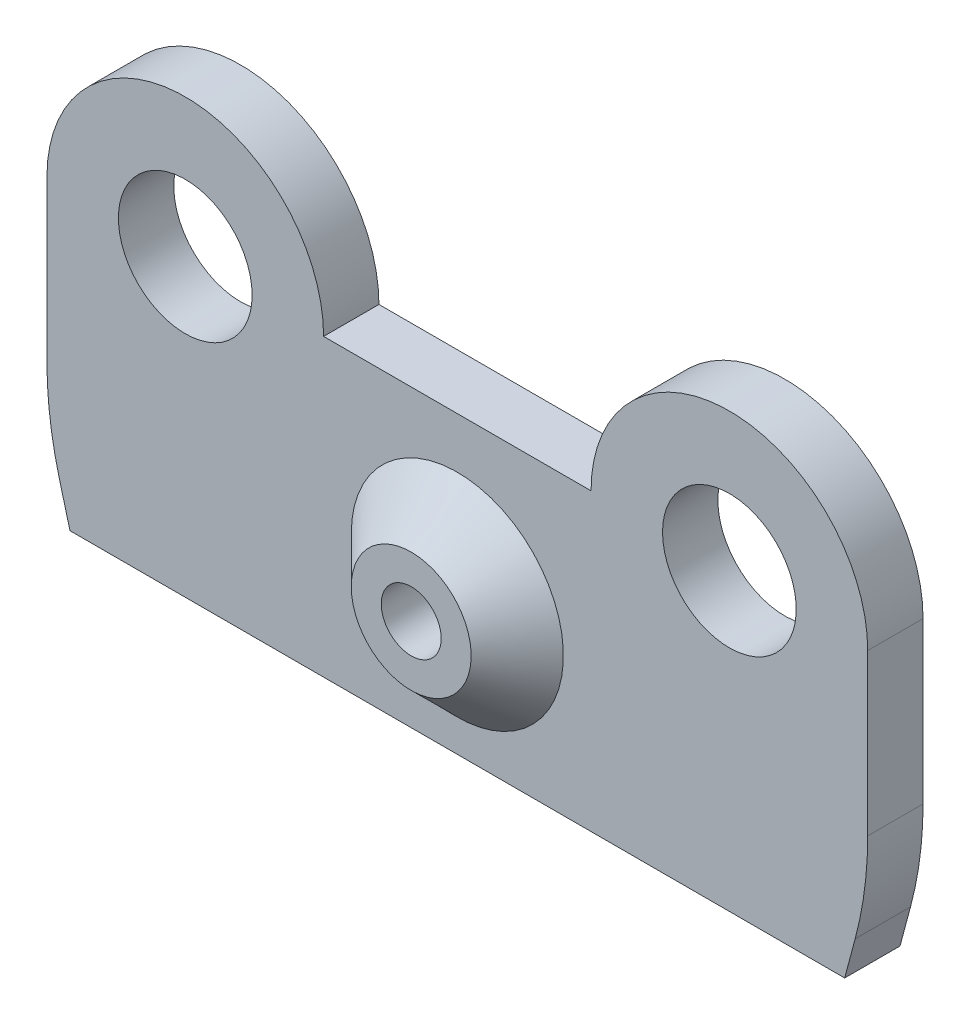
ISO-10303-21;
HEADER;
FILE_DESCRIPTION(('STEP AP214'),'2;1');
FILE_NAME('part.step','',(''),(''),'','','');
FILE_SCHEMA(('AUTOMOTIVE_DESIGN { 1 0 10303 214 1 1 1 1 }'));
ENDSEC;
DATA;
#1=APPLICATION_CONTEXT('core data for automotive mechanical design processes');
#2=APPLICATION_PROTOCOL_DEFINITION('international standard','automotive_design',2000,#1);
#3=PRODUCT_CONTEXT('',#1,'mechanical');
#4=PRODUCT('Part','Part','',(#3));
#5=PRODUCT_RELATED_PRODUCT_CATEGORY('part','',(#4));
#6=PRODUCT_DEFINITION_FORMATION('','',#4);
#7=PRODUCT_DEFINITION_CONTEXT('part definition',#1,'design');
#8=PRODUCT_DEFINITION('design','',#6,#7);
#9=PRODUCT_DEFINITION_SHAPE('','',#8);
#10=(LENGTH_UNIT() NAMED_UNIT(*) SI_UNIT(.MILLI.,.METRE.));
#11=(NAMED_UNIT(*) PLANE_ANGLE_UNIT() SI_UNIT($,.RADIAN.));
#12=(NAMED_UNIT(*) SI_UNIT($,.STERADIAN.) SOLID_ANGLE_UNIT());
#13=UNCERTAINTY_MEASURE_WITH_UNIT(LENGTH_MEASURE(1.E-05),#10,'distance_accuracy_value','');
#14=(GEOMETRIC_REPRESENTATION_CONTEXT(3) GLOBAL_UNCERTAINTY_ASSIGNED_CONTEXT((#13)) GLOBAL_UNIT_ASSIGNED_CONTEXT((#10,
#11,#12)) REPRESENTATION_CONTEXT('',''));
#15=CARTESIAN_POINT('',(0.,0.,0.));
#16=DIRECTION('',(0.,0.,1.));
#17=DIRECTION('',(1.,0.,0.));
#18=AXIS2_PLACEMENT_3D('',#15,#16,#17);
#19=CARTESIAN_POINT('',(29.5,0.,6.));
#20=DIRECTION('',(0.,0.,-1.));
#21=DIRECTION('',(-1.,0.,0.));
#22=AXIS2_PLACEMENT_3D('',#19,#20,#21);
#23=PLANE('',#22);
#24=CARTESIAN_POINT('',(0.,-17.,6.));
#25=DIRECTION('',(0.,0.,-1.));
#26=DIRECTION('',(-1.,0.,0.));
#27=AXIS2_PLACEMENT_3D('',#24,#25,#26);
#28=CIRCLE('',#27,11.5);
#29=CARTESIAN_POINT('',(-11.5,-17.,6.));
#30=VERTEX_POINT('',#29);
#31=EDGE_CURVE('E131',#30,#30,#28,.T.);
#32=ORIENTED_EDGE('',*,*,#31,.T.);
#33=EDGE_LOOP('',(#32));
#34=FACE_BOUND('',#33,.T.);
#35=CARTESIAN_POINT('',(29.5,0.,6.));
#36=DIRECTION('',(0.,0.,1.));
#37=DIRECTION('',(-1.,0.,0.));
#38=AXIS2_PLACEMENT_3D('',#35,#36,#37);
#39=CIRCLE('',#38,7.25);
#40=CARTESIAN_POINT('',(22.25,0.,6.));
#41=VERTEX_POINT('',#40);
#42=EDGE_CURVE('E384',#41,#41,#39,.T.);
#43=ORIENTED_EDGE('',*,*,#42,.F.);
#44=EDGE_LOOP('',(#43));
#45=FACE_BOUND('',#44,.T.);
#46=CARTESIAN_POINT('',(-29.5,0.,6.));
#47=DIRECTION('',(0.,0.,1.));
#48=DIRECTION('',(1.,0.,0.));
#49=AXIS2_PLACEMENT_3D('',#46,#47,#48);
#50=CIRCLE('',#49,7.25);
#51=CARTESIAN_POINT('',(-22.25,0.,6.));
#52=VERTEX_POINT('',#51);
#53=EDGE_CURVE('E169',#52,#52,#50,.T.);
#54=ORIENTED_EDGE('',*,*,#53,.F.);
#55=EDGE_LOOP('',(#54));
#56=FACE_BOUND('',#55,.T.);
#57=DIRECTION('',(-0.258819045102521,-0.965925826289068,0.));
#58=VECTOR('',#57,1.);
#59=CARTESIAN_POINT('',(44.5,-22.6698729810778,6.));
#60=LINE('',#59,#58);
#61=CARTESIAN_POINT('',(42.,-32.,6.));
#62=VERTEX_POINT('',#61);
#63=CARTESIAN_POINT('',(43.1370330515627,-27.7565348816827,6.));
#64=VERTEX_POINT('',#63);
#65=EDGE_CURVE('E160',#62,#64,#60,.F.);
#66=ORIENTED_EDGE('',*,*,#65,.T.);
#67=CARTESIAN_POINT('',(4.49999999999999,-17.4037730775819,6.));
#68=DIRECTION('',(0.,0.,-1.));
#69=DIRECTION('',(-1.,0.,0.));
#70=AXIS2_PLACEMENT_3D('',#67,#68,#69);
#71=CIRCLE('',#70,40.);
#72=CARTESIAN_POINT('',(44.5,-17.4037730775819,6.));
#73=VERTEX_POINT('',#72);
#74=EDGE_CURVE('E11',#64,#73,#71,.F.);
#75=ORIENTED_EDGE('',*,*,#74,.T.);
#76=DIRECTION('',(0.,1.,0.));
#77=VECTOR('',#76,1.);
#78=CARTESIAN_POINT('',(44.5,-32.,6.));
#79=LINE('',#78,#77);
#80=CARTESIAN_POINT('',(44.5,0.,6.));
#81=VERTEX_POINT('',#80);
#82=EDGE_CURVE('E108',#73,#81,#79,.T.);
#83=ORIENTED_EDGE('',*,*,#82,.T.);
#84=CARTESIAN_POINT('',(29.5,0.,6.));
#85=DIRECTION('',(0.,0.,1.));
#86=DIRECTION('',(-1.,0.,0.));
#87=AXIS2_PLACEMENT_3D('',#84,#85,#86);
#88=CIRCLE('',#87,15.);
#89=CARTESIAN_POINT('',(14.5,0.,6.));
#90=VERTEX_POINT('',#89);
#91=EDGE_CURVE('E110',#81,#90,#88,.T.);
#92=ORIENTED_EDGE('',*,*,#91,.T.);
#93=DIRECTION('',(-1.,0.,0.));
#94=VECTOR('',#93,1.);
#95=CARTESIAN_POINT('',(-14.5,0.,6.));
#96=LINE('',#95,#94);
#97=CARTESIAN_POINT('',(-14.5,0.,6.));
#98=VERTEX_POINT('',#97);
#99=EDGE_CURVE('E126',#90,#98,#96,.T.);
#100=ORIENTED_EDGE('',*,*,#99,.T.);
#101=CARTESIAN_POINT('',(-29.5,0.,6.));
#102=DIRECTION('',(0.,0.,1.));
#103=DIRECTION('',(1.,0.,0.));
#104=AXIS2_PLACEMENT_3D('',#101,#102,#103);
#105=CIRCLE('',#104,15.);
#106=CARTESIAN_POINT('',(-44.5,0.,6.));
#107=VERTEX_POINT('',#106);
#108=EDGE_CURVE('E197',#98,#107,#105,.T.);
#109=ORIENTED_EDGE('',*,*,#108,.T.);
#110=DIRECTION('',(0.,-1.,0.));
#111=VECTOR('',#110,1.);
#112=CARTESIAN_POINT('',(-44.5,0.,6.));
#113=LINE('',#112,#111);
#114=CARTESIAN_POINT('',(-44.5,-17.4037730775819,6.));
#115=VERTEX_POINT('',#114);
#116=EDGE_CURVE('E212',#107,#115,#113,.T.);
#117=ORIENTED_EDGE('',*,*,#116,.T.);
#118=CARTESIAN_POINT('',(-4.49999999999999,-17.4037730775819,6.));
#119=DIRECTION('',(0.,0.,-1.));
#120=DIRECTION('',(-1.,0.,0.));
#121=AXIS2_PLACEMENT_3D('',#118,#119,#120);
#122=CIRCLE('',#121,40.);
#123=CARTESIAN_POINT('',(-43.1370330515627,-27.7565348816828,6.));
#124=VERTEX_POINT('',#123);
#125=EDGE_CURVE('E150',#115,#124,#122,.F.);
#126=ORIENTED_EDGE('',*,*,#125,.T.);
#127=DIRECTION('',(-0.258819045102521,0.965925826289068,0.));
#128=VECTOR('',#127,1.);
#129=CARTESIAN_POINT('',(-42.,-32.,6.));
#130=LINE('',#129,#128);
#131=CARTESIAN_POINT('',(-42.,-32.,6.));
#132=VERTEX_POINT('',#131);
#133=EDGE_CURVE('E145',#124,#132,#130,.F.);
#134=ORIENTED_EDGE('',*,*,#133,.T.);
#135=DIRECTION('',(1.,0.,0.));
#136=VECTOR('',#135,1.);
#137=CARTESIAN_POINT('',(-44.5,-32.,6.));
#138=LINE('',#137,#136);
#139=EDGE_CURVE('E177',#132,#62,#138,.T.);
#140=ORIENTED_EDGE('',*,*,#139,.T.);
#141=EDGE_LOOP('',(#66,#75,#83,#92,#100,#109,#117,#126,#134,#140));
#142=FACE_BOUND('',#141,.T.);
#143=ADVANCED_FACE('F33',(#34,#45,#56,#142),#23,.F.);
#144=CARTESIAN_POINT('',(29.5,0.,0.));
#145=DIRECTION('',(0.,0.,-1.));
#146=DIRECTION('',(-1.,0.,0.));
#147=AXIS2_PLACEMENT_3D('',#144,#145,#146);
#148=PLANE('',#147);
#149=CARTESIAN_POINT('',(0.,-17.,0.));
#150=DIRECTION('',(0.,0.,1.));
#151=DIRECTION('',(1.,0.,0.));
#152=AXIS2_PLACEMENT_3D('',#149,#150,#151);
#153=CIRCLE('',#152,3.25);
#154=CARTESIAN_POINT('',(3.25,-17.,0.));
#155=VERTEX_POINT('',#154);
#156=EDGE_CURVE('E387',#155,#155,#153,.T.);
#157=ORIENTED_EDGE('',*,*,#156,.T.);
#158=EDGE_LOOP('',(#157));
#159=FACE_BOUND('',#158,.T.);
#160=DIRECTION('',(0.,1.,0.));
#161=VECTOR('',#160,1.);
#162=CARTESIAN_POINT('',(44.5,-32.,0.));
#163=LINE('',#162,#161);
#164=CARTESIAN_POINT('',(44.5,-17.4037730775819,0.));
#165=VERTEX_POINT('',#164);
#166=CARTESIAN_POINT('',(44.5,0.,0.));
#167=VERTEX_POINT('',#166);
#168=EDGE_CURVE('E129',#165,#167,#163,.T.);
#169=ORIENTED_EDGE('',*,*,#168,.F.);
#170=CARTESIAN_POINT('',(4.49999999999999,-17.4037730775819,0.));
#171=DIRECTION('',(0.,0.,-1.));
#172=DIRECTION('',(-1.,0.,0.));
#173=AXIS2_PLACEMENT_3D('',#170,#171,#172);
#174=CIRCLE('',#173,40.);
#175=CARTESIAN_POINT('',(43.1370330515627,-27.7565348816828,0.));
#176=VERTEX_POINT('',#175);
#177=EDGE_CURVE('E55',#165,#176,#174,.T.);
#178=ORIENTED_EDGE('',*,*,#177,.T.);
#179=DIRECTION('',(0.258819045102521,0.965925826289068,0.));
#180=VECTOR('',#179,1.);
#181=CARTESIAN_POINT('',(49.1626587736527,-5.26859353944898,0.));
#182=LINE('',#181,#180);
#183=CARTESIAN_POINT('',(42.,-32.,0.));
#184=VERTEX_POINT('',#183);
#185=EDGE_CURVE('E156',#176,#184,#182,.F.);
#186=ORIENTED_EDGE('',*,*,#185,.T.);
#187=DIRECTION('',(1.,0.,0.));
#188=VECTOR('',#187,1.);
#189=CARTESIAN_POINT('',(-44.5,-32.,0.));
#190=LINE('',#189,#188);
#191=CARTESIAN_POINT('',(-42.,-32.,0.));
#192=VERTEX_POINT('',#191);
#193=EDGE_CURVE('E117',#192,#184,#190,.T.);
#194=ORIENTED_EDGE('',*,*,#193,.F.);
#195=DIRECTION('',(0.258819045102521,-0.965925826289068,0.));
#196=VECTOR('',#195,1.);
#197=CARTESIAN_POINT('',(-45.2104081852937,-20.018593539449,0.));
#198=LINE('',#197,#196);
#199=CARTESIAN_POINT('',(-43.1370330515627,-27.7565348816828,0.));
#200=VERTEX_POINT('',#199);
#201=EDGE_CURVE('E142',#192,#200,#198,.F.);
#202=ORIENTED_EDGE('',*,*,#201,.T.);
#203=CARTESIAN_POINT('',(-4.49999999999999,-17.4037730775819,0.));
#204=DIRECTION('',(0.,0.,-1.));
#205=DIRECTION('',(-1.,0.,0.));
#206=AXIS2_PLACEMENT_3D('',#203,#204,#205);
#207=CIRCLE('',#206,40.);
#208=CARTESIAN_POINT('',(-44.5,-17.4037730775819,0.));
#209=VERTEX_POINT('',#208);
#210=EDGE_CURVE('E154',#200,#209,#207,.T.);
#211=ORIENTED_EDGE('',*,*,#210,.T.);
#212=DIRECTION('',(0.,-1.,0.));
#213=VECTOR('',#212,1.);
#214=CARTESIAN_POINT('',(-44.5,0.,0.));
#215=LINE('',#214,#213);
#216=CARTESIAN_POINT('',(-44.5,0.,0.));
#217=VERTEX_POINT('',#216);
#218=EDGE_CURVE('E183',#217,#209,#215,.T.);
#219=ORIENTED_EDGE('',*,*,#218,.F.);
#220=CARTESIAN_POINT('',(-29.5,0.,0.));
#221=DIRECTION('',(0.,0.,1.));
#222=DIRECTION('',(1.,0.,0.));
#223=AXIS2_PLACEMENT_3D('',#220,#221,#222);
#224=CIRCLE('',#223,15.);
#225=CARTESIAN_POINT('',(-14.5,0.,0.));
#226=VERTEX_POINT('',#225);
#227=EDGE_CURVE('E181',#226,#217,#224,.T.);
#228=ORIENTED_EDGE('',*,*,#227,.F.);
#229=DIRECTION('',(-1.,0.,0.));
#230=VECTOR('',#229,1.);
#231=CARTESIAN_POINT('',(-14.5,0.,0.));
#232=LINE('',#231,#230);
#233=CARTESIAN_POINT('',(14.5,0.,0.));
#234=VERTEX_POINT('',#233);
#235=EDGE_CURVE('E171',#234,#226,#232,.T.);
#236=ORIENTED_EDGE('',*,*,#235,.F.);
#237=CARTESIAN_POINT('',(29.5,0.,0.));
#238=DIRECTION('',(0.,0.,1.));
#239=DIRECTION('',(-1.,0.,0.));
#240=AXIS2_PLACEMENT_3D('',#237,#238,#239);
#241=CIRCLE('',#240,15.);
#242=EDGE_CURVE('E168',#167,#234,#241,.T.);
#243=ORIENTED_EDGE('',*,*,#242,.F.);
#244=EDGE_LOOP('',(#169,#178,#186,#194,#202,#211,#219,#228,#236,#243));
#245=FACE_BOUND('',#244,.T.);
#246=CARTESIAN_POINT('',(-29.5,0.,0.));
#247=DIRECTION('',(0.,0.,1.));
#248=DIRECTION('',(1.,0.,0.));
#249=AXIS2_PLACEMENT_3D('',#246,#247,#248);
#250=CIRCLE('',#249,7.25);
#251=CARTESIAN_POINT('',(-22.25,0.,0.));
#252=VERTEX_POINT('',#251);
#253=EDGE_CURVE('E174',#252,#252,#250,.T.);
#254=ORIENTED_EDGE('',*,*,#253,.T.);
#255=EDGE_LOOP('',(#254));
#256=FACE_BOUND('',#255,.T.);
#257=CARTESIAN_POINT('',(29.5,0.,0.));
#258=DIRECTION('',(0.,0.,1.));
#259=DIRECTION('',(-1.,0.,0.));
#260=AXIS2_PLACEMENT_3D('',#257,#258,#259);
#261=CIRCLE('',#260,7.25);
#262=CARTESIAN_POINT('',(22.25,0.,0.));
#263=VERTEX_POINT('',#262);
#264=EDGE_CURVE('E381',#263,#263,#261,.T.);
#265=ORIENTED_EDGE('',*,*,#264,.T.);
#266=EDGE_LOOP('',(#265));
#267=FACE_BOUND('',#266,.T.);
#268=ADVANCED_FACE('F165',(#159,#245,#256,#267),#148,.T.);
#269=CARTESIAN_POINT('',(44.5,-32.,6.));
#270=DIRECTION('',(-1.,0.,0.));
#271=DIRECTION('',(0.,-1.,0.));
#272=AXIS2_PLACEMENT_3D('',#269,#270,#271);
#273=PLANE('',#272);
#274=ORIENTED_EDGE('',*,*,#82,.F.);
#275=DIRECTION('',(0.,0.,1.));
#276=VECTOR('',#275,1.);
#277=CARTESIAN_POINT('',(44.5,-17.4037730775819,0.));
#278=LINE('',#277,#276);
#279=EDGE_CURVE('E162',#73,#165,#278,.F.);
#280=ORIENTED_EDGE('',*,*,#279,.T.);
#281=ORIENTED_EDGE('',*,*,#168,.T.);
#282=DIRECTION('',(0.,0.,-1.));
#283=VECTOR('',#282,1.);
#284=CARTESIAN_POINT('',(44.5,0.,6.));
#285=LINE('',#284,#283);
#286=EDGE_CURVE('E122',#81,#167,#285,.T.);
#287=ORIENTED_EDGE('',*,*,#286,.F.);
#288=EDGE_LOOP('',(#274,#280,#281,#287));
#289=FACE_BOUND('',#288,.T.);
#290=ADVANCED_FACE('F128',(#289),#273,.F.);
#291=CARTESIAN_POINT('',(29.5,0.,6.));
#292=DIRECTION('',(0.,0.,-1.));
#293=DIRECTION('',(-1.,0.,0.));
#294=AXIS2_PLACEMENT_3D('',#291,#292,#293);
#295=CYLINDRICAL_SURFACE('',#294,15.);
#296=ORIENTED_EDGE('',*,*,#242,.T.);
#297=DIRECTION('',(0.,0.,-1.));
#298=VECTOR('',#297,1.);
#299=CARTESIAN_POINT('',(14.5,0.,6.));
#300=LINE('',#299,#298);
#301=EDGE_CURVE('E124',#90,#234,#300,.T.);
#302=ORIENTED_EDGE('',*,*,#301,.F.);
#303=ORIENTED_EDGE('',*,*,#91,.F.);
#304=ORIENTED_EDGE('',*,*,#286,.T.);
#305=EDGE_LOOP('',(#296,#302,#303,#304));
#306=FACE_BOUND('',#305,.T.);
#307=ADVANCED_FACE('F121',(#306),#295,.T.);
#308=CARTESIAN_POINT('',(-14.5,0.,6.));
#309=DIRECTION('',(0.,-1.,0.));
#310=DIRECTION('',(0.,0.,-1.));
#311=AXIS2_PLACEMENT_3D('',#308,#309,#310);
#312=PLANE('',#311);
#313=ORIENTED_EDGE('',*,*,#235,.T.);
#314=DIRECTION('',(0.,0.,-1.));
#315=VECTOR('',#314,1.);
#316=CARTESIAN_POINT('',(-14.5,0.,6.));
#317=LINE('',#316,#315);
#318=EDGE_CURVE('E136',#98,#226,#317,.T.);
#319=ORIENTED_EDGE('',*,*,#318,.F.);
#320=ORIENTED_EDGE('',*,*,#99,.F.);
#321=ORIENTED_EDGE('',*,*,#301,.T.);
#322=EDGE_LOOP('',(#313,#319,#320,#321));
#323=FACE_BOUND('',#322,.T.);
#324=ADVANCED_FACE('F244',(#323),#312,.F.);
#325=CARTESIAN_POINT('',(-29.5,0.,6.));
#326=DIRECTION('',(0.,0.,-1.));
#327=DIRECTION('',(-1.,0.,0.));
#328=AXIS2_PLACEMENT_3D('',#325,#326,#327);
#329=CYLINDRICAL_SURFACE('',#328,15.);
#330=ORIENTED_EDGE('',*,*,#227,.T.);
#331=DIRECTION('',(0.,0.,-1.));
#332=VECTOR('',#331,1.);
#333=CARTESIAN_POINT('',(-44.5,0.,6.));
#334=LINE('',#333,#332);
#335=EDGE_CURVE('E188',#107,#217,#334,.T.);
#336=ORIENTED_EDGE('',*,*,#335,.F.);
#337=ORIENTED_EDGE('',*,*,#108,.F.);
#338=ORIENTED_EDGE('',*,*,#318,.T.);
#339=EDGE_LOOP('',(#330,#336,#337,#338));
#340=FACE_BOUND('',#339,.T.);
#341=ADVANCED_FACE('F195',(#340),#329,.T.);
#342=CARTESIAN_POINT('',(-44.5,0.,6.));
#343=DIRECTION('',(1.,0.,0.));
#344=DIRECTION('',(0.,1.,0.));
#345=AXIS2_PLACEMENT_3D('',#342,#343,#344);
#346=PLANE('',#345);
#347=ORIENTED_EDGE('',*,*,#218,.T.);
#348=DIRECTION('',(0.,0.,-1.));
#349=VECTOR('',#348,1.);
#350=CARTESIAN_POINT('',(-44.5,-17.4037730775819,6.));
#351=LINE('',#350,#349);
#352=EDGE_CURVE('E147',#209,#115,#351,.F.);
#353=ORIENTED_EDGE('',*,*,#352,.T.);
#354=ORIENTED_EDGE('',*,*,#116,.F.);
#355=ORIENTED_EDGE('',*,*,#335,.T.);
#356=EDGE_LOOP('',(#347,#353,#354,#355));
#357=FACE_BOUND('',#356,.T.);
#358=ADVANCED_FACE('F203',(#357),#346,.F.);
#359=CARTESIAN_POINT('',(-44.5,-32.,6.));
#360=DIRECTION('',(0.,1.,0.));
#361=DIRECTION('',(0.,0.,1.));
#362=AXIS2_PLACEMENT_3D('',#359,#360,#361);
#363=PLANE('',#362);
#364=ORIENTED_EDGE('',*,*,#193,.T.);
#365=DIRECTION('',(0.,0.,1.));
#366=VECTOR('',#365,1.);
#367=CARTESIAN_POINT('',(42.,-32.,6.));
#368=LINE('',#367,#366);
#369=EDGE_CURVE('E158',#184,#62,#368,.T.);
#370=ORIENTED_EDGE('',*,*,#369,.T.);
#371=ORIENTED_EDGE('',*,*,#139,.F.);
#372=DIRECTION('',(0.,0.,-1.));
#373=VECTOR('',#372,1.);
#374=CARTESIAN_POINT('',(-42.,-32.,6.));
#375=LINE('',#374,#373);
#376=EDGE_CURVE('E134',#132,#192,#375,.T.);
#377=ORIENTED_EDGE('',*,*,#376,.T.);
#378=EDGE_LOOP('',(#364,#370,#371,#377));
#379=FACE_BOUND('',#378,.T.);
#380=ADVANCED_FACE('F218',(#379),#363,.F.);
#381=CARTESIAN_POINT('',(-29.5,0.,6.));
#382=DIRECTION('',(0.,0.,-1.));
#383=DIRECTION('',(-1.,0.,0.));
#384=AXIS2_PLACEMENT_3D('',#381,#382,#383);
#385=CYLINDRICAL_SURFACE('',#384,7.25);
#386=ORIENTED_EDGE('',*,*,#53,.T.);
#387=EDGE_LOOP('',(#386));
#388=FACE_BOUND('',#387,.T.);
#389=ORIENTED_EDGE('',*,*,#253,.F.);
#390=EDGE_LOOP('',(#389));
#391=FACE_BOUND('',#390,.T.);
#392=ADVANCED_FACE('F235',(#388,#391),#385,.F.);
#393=CARTESIAN_POINT('',(0.,-17.,6.));
#394=DIRECTION('',(0.,0.,-1.));
#395=DIRECTION('',(-1.,0.,0.));
#396=AXIS2_PLACEMENT_3D('',#393,#394,#395);
#397=CYLINDRICAL_SURFACE('',#396,3.25);
#398=ORIENTED_EDGE('',*,*,#156,.F.);
#399=EDGE_LOOP('',(#398));
#400=FACE_BOUND('',#399,.T.);
#401=CARTESIAN_POINT('',(0.,-17.,11.));
#402=DIRECTION('',(0.,0.,1.));
#403=DIRECTION('',(1.,0.,0.));
#404=AXIS2_PLACEMENT_3D('',#401,#402,#403);
#405=CIRCLE('',#404,3.25);
#406=CARTESIAN_POINT('',(3.25,-17.,11.));
#407=VERTEX_POINT('',#406);
#408=EDGE_CURVE('E378',#407,#407,#405,.T.);
#409=ORIENTED_EDGE('',*,*,#408,.T.);
#410=EDGE_LOOP('',(#409));
#411=FACE_BOUND('',#410,.T.);
#412=ADVANCED_FACE('F308',(#400,#411),#397,.F.);
#413=CARTESIAN_POINT('',(29.5,0.,6.));
#414=DIRECTION('',(0.,0.,-1.));
#415=DIRECTION('',(-1.,0.,0.));
#416=AXIS2_PLACEMENT_3D('',#413,#414,#415);
#417=CYLINDRICAL_SURFACE('',#416,7.25);
#418=ORIENTED_EDGE('',*,*,#42,.T.);
#419=EDGE_LOOP('',(#418));
#420=FACE_BOUND('',#419,.T.);
#421=ORIENTED_EDGE('',*,*,#264,.F.);
#422=EDGE_LOOP('',(#421));
#423=FACE_BOUND('',#422,.T.);
#424=ADVANCED_FACE('F316',(#420,#423),#417,.F.);
#425=CARTESIAN_POINT('',(0.,-17.,11.));
#426=DIRECTION('',(0.,0.,1.));
#427=DIRECTION('',(1.,0.,0.));
#428=AXIS2_PLACEMENT_3D('',#425,#426,#427);
#429=PLANE('',#428);
#430=CARTESIAN_POINT('',(0.,-17.,11.));
#431=DIRECTION('',(0.,0.,1.));
#432=DIRECTION('',(1.,0.,0.));
#433=AXIS2_PLACEMENT_3D('',#430,#431,#432);
#434=CIRCLE('',#433,6.5);
#435=CARTESIAN_POINT('',(-6.50000000000003,-17.,11.));
#436=VERTEX_POINT('',#435);
#437=EDGE_CURVE('E375',#436,#436,#434,.T.);
#438=ORIENTED_EDGE('',*,*,#437,.T.);
#439=EDGE_LOOP('',(#438));
#440=FACE_BOUND('',#439,.T.);
#441=ORIENTED_EDGE('',*,*,#408,.F.);
#442=EDGE_LOOP('',(#441));
#443=FACE_BOUND('',#442,.T.);
#444=ADVANCED_FACE('F254',(#440,#443),#429,.T.);
#445=CARTESIAN_POINT('',(0.,-17.,11.));
#446=DIRECTION('',(0.,0.,-1.));
#447=DIRECTION('',(-1.,0.,0.));
#448=AXIS2_PLACEMENT_3D('',#445,#446,#447);
#449=CONICAL_SURFACE('',#448,6.5,0.785398163397443);
#450=CARTESIAN_POINT('',(-11.5,-17.,6.));
#451=CARTESIAN_POINT('',(-11.4479166666666,-17.,6.05208333333333));
#452=CARTESIAN_POINT('',(-11.3958333333333,-17.,6.10416666666667));
#453=CARTESIAN_POINT('',(-11.2916666666666,-17.,6.20833333333333));
#454=CARTESIAN_POINT('',(-11.2395833333333,-17.,6.26041666666667));
#455=CARTESIAN_POINT('',(-11.1354166666666,-17.,6.36458333333333));
#456=CARTESIAN_POINT('',(-11.0833333333333,-17.,6.41666666666667));
#457=CARTESIAN_POINT('',(-10.9791666666666,-17.,6.52083333333333));
#458=CARTESIAN_POINT('',(-10.9270833333333,-17.,6.57291666666667));
#459=CARTESIAN_POINT('',(-10.8229166666666,-17.,6.67708333333333));
#460=CARTESIAN_POINT('',(-10.7708333333333,-17.,6.72916666666667));
#461=CARTESIAN_POINT('',(-10.6666666666666,-17.,6.83333333333333));
#462=CARTESIAN_POINT('',(-10.6145833333333,-17.,6.88541666666667));
#463=CARTESIAN_POINT('',(-10.5104166666666,-17.,6.98958333333333));
#464=CARTESIAN_POINT('',(-10.4583333333333,-17.,7.04166666666667));
#465=CARTESIAN_POINT('',(-10.3541666666666,-17.,7.14583333333333));
#466=CARTESIAN_POINT('',(-10.3020833333333,-17.,7.19791666666667));
#467=CARTESIAN_POINT('',(-10.1979166666667,-17.,7.30208333333333));
#468=CARTESIAN_POINT('',(-10.1458333333333,-17.,7.35416666666667));
#469=CARTESIAN_POINT('',(-10.0416666666667,-17.,7.45833333333333));
#470=CARTESIAN_POINT('',(-9.98958333333332,-17.,7.51041666666667));
#471=CARTESIAN_POINT('',(-9.88541666666665,-17.,7.61458333333333));
#472=CARTESIAN_POINT('',(-9.83333333333332,-17.,7.66666666666667));
#473=CARTESIAN_POINT('',(-9.72916666666666,-17.,7.77083333333333));
#474=CARTESIAN_POINT('',(-9.67708333333332,-17.,7.82291666666667));
#475=CARTESIAN_POINT('',(-9.57291666666666,-17.,7.92708333333333));
#476=CARTESIAN_POINT('',(-9.52083333333333,-17.,7.97916666666667));
#477=CARTESIAN_POINT('',(-9.41666666666666,-17.,8.08333333333333));
#478=CARTESIAN_POINT('',(-9.36458333333333,-17.,8.13541666666667));
#479=CARTESIAN_POINT('',(-9.26041666666666,-17.,8.23958333333333));
#480=CARTESIAN_POINT('',(-9.20833333333333,-17.,8.29166666666667));
#481=CARTESIAN_POINT('',(-9.10416666666666,-17.,8.39583333333333));
#482=CARTESIAN_POINT('',(-9.05208333333333,-17.,8.44791666666667));
#483=CARTESIAN_POINT('',(-8.94791666666666,-17.,8.55208333333333));
#484=CARTESIAN_POINT('',(-8.89583333333333,-17.,8.60416666666667));
#485=CARTESIAN_POINT('',(-8.79166666666667,-17.,8.70833333333333));
#486=CARTESIAN_POINT('',(-8.73958333333333,-17.,8.76041666666667));
#487=CARTESIAN_POINT('',(-8.63541666666667,-17.,8.86458333333333));
#488=CARTESIAN_POINT('',(-8.58333333333334,-17.,8.91666666666667));
#489=CARTESIAN_POINT('',(-8.47916666666667,-17.,9.02083333333333));
#490=CARTESIAN_POINT('',(-8.42708333333334,-17.,9.07291666666667));
#491=CARTESIAN_POINT('',(-8.32291666666667,-17.,9.17708333333333));
#492=CARTESIAN_POINT('',(-8.27083333333334,-17.,9.22916666666667));
#493=CARTESIAN_POINT('',(-8.16666666666667,-17.,9.33333333333333));
#494=CARTESIAN_POINT('',(-8.11458333333334,-17.,9.38541666666667));
#495=CARTESIAN_POINT('',(-8.01041666666668,-17.,9.48958333333333));
#496=CARTESIAN_POINT('',(-7.95833333333334,-17.,9.54166666666667));
#497=CARTESIAN_POINT('',(-7.85416666666668,-17.,9.64583333333333));
#498=CARTESIAN_POINT('',(-7.80208333333334,-17.,9.69791666666667));
#499=CARTESIAN_POINT('',(-7.69791666666668,-17.,9.80208333333333));
#500=CARTESIAN_POINT('',(-7.64583333333335,-17.,9.85416666666667));
#501=CARTESIAN_POINT('',(-7.54166666666668,-17.,9.95833333333333));
#502=CARTESIAN_POINT('',(-7.48958333333335,-17.,10.0104166666667));
#503=CARTESIAN_POINT('',(-7.38541666666668,-17.,10.1145833333333));
#504=CARTESIAN_POINT('',(-7.33333333333335,-17.,10.1666666666667));
#505=CARTESIAN_POINT('',(-7.22916666666669,-17.,10.2708333333333));
#506=CARTESIAN_POINT('',(-7.17708333333335,-17.,10.3229166666667));
#507=CARTESIAN_POINT('',(-7.07291666666669,-17.,10.4270833333333));
#508=CARTESIAN_POINT('',(-7.02083333333335,-17.,10.4791666666667));
#509=CARTESIAN_POINT('',(-6.91666666666669,-17.,10.5833333333333));
#510=CARTESIAN_POINT('',(-6.86458333333336,-17.,10.6354166666667));
#511=CARTESIAN_POINT('',(-6.76041666666669,-17.,10.7395833333333));
#512=CARTESIAN_POINT('',(-6.70833333333336,-17.,10.7916666666667));
#513=CARTESIAN_POINT('',(-6.60416666666669,-17.,10.8958333333333));
#514=CARTESIAN_POINT('',(-6.55208333333336,-17.,10.9479166666667));
#515=CARTESIAN_POINT('',(-6.50000000000003,-17.,11.));
#516=B_SPLINE_CURVE_WITH_KNOTS('',3,(#450,#451,#452,#453,#454,#455,#456,#457,#458,#459,#460,
#461,#462,#463,#464,#465,#466,#467,#468,#469,#470,#471,#472,#473,#474,#475,#476,#477,#478,#479,
#480,#481,#482,#483,#484,#485,#486,#487,#488,#489,#490,#491,#492,#493,#494,#495,#496,#497,#498,
#499,#500,#501,#502,#503,#504,#505,#506,#507,#508,#509,#510,#511,#512,#513,#514,#515),
.UNSPECIFIED.,.F.,.F.,(4,2,2,2,2,2,2,2,2,2,2,2,2,2,2,2,2,2,2,2,2,2,2,2,2,2,2,2,2,2,2,2,4),(0.,
0.220970869120795,0.44194173824159,0.662912607362383,0.88388347648318,1.10485434560397,
1.32582521472477,1.54679608384556,1.76776695296636,1.98873782208715,2.20970869120795,
2.43067956032874,2.65165042944954,2.87262129857033,3.09359216769113,3.31456303681192,
3.53553390593272,3.75650477505351,3.9774756441743,4.1984465132951,4.41941738241589,
4.64038825153669,4.86135912065748,5.08232998977828,5.30330085889907,5.52427172801987,
5.74524259714066,5.96621346626146,6.18718433538225,6.40815520450305,6.62912607362384,
6.85009694274464,7.07106781186543),.UNSPECIFIED.);
#517=EDGE_CURVE('BSEAM251',#30,#436,#516,.T.);
#518=ORIENTED_EDGE('',*,*,#31,.F.);
#519=ORIENTED_EDGE('',*,*,#437,.F.);
#520=ORIENTED_EDGE('',*,*,#517,.T.);
#521=ORIENTED_EDGE('',*,*,#517,.F.);
#522=EDGE_LOOP('',(#518,#520,#519,#521));
#523=FACE_BOUND('',#522,.T.);
#524=ADVANCED_FACE('F251',(#523),#449,.T.);
#525=CARTESIAN_POINT('',(-42.,-32.,6.));
#526=DIRECTION('',(0.965925826289068,0.258819045102521,0.));
#527=DIRECTION('',(0.,0.,-1.));
#528=AXIS2_PLACEMENT_3D('',#525,#526,#527);
#529=PLANE('',#528);
#530=ORIENTED_EDGE('',*,*,#133,.F.);
#531=DIRECTION('',(0.,0.,1.));
#532=VECTOR('',#531,1.);
#533=CARTESIAN_POINT('',(-43.1370330515627,-27.7565348816828,0.));
#534=LINE('',#533,#532);
#535=EDGE_CURVE('E152',#124,#200,#534,.F.);
#536=ORIENTED_EDGE('',*,*,#535,.T.);
#537=ORIENTED_EDGE('',*,*,#201,.F.);
#538=ORIENTED_EDGE('',*,*,#376,.F.);
#539=EDGE_LOOP('',(#530,#536,#537,#538));
#540=FACE_BOUND('',#539,.T.);
#541=ADVANCED_FACE('F215',(#540),#529,.F.);
#542=CARTESIAN_POINT('',(-4.49999999999999,-17.4037730775819,6.));
#543=DIRECTION('',(0.,0.,1.));
#544=DIRECTION('',(1.,0.,0.));
#545=AXIS2_PLACEMENT_3D('',#542,#543,#544);
#546=CYLINDRICAL_SURFACE('',#545,40.);
#547=ORIENTED_EDGE('',*,*,#210,.F.);
#548=ORIENTED_EDGE('',*,*,#535,.F.);
#549=ORIENTED_EDGE('',*,*,#125,.F.);
#550=ORIENTED_EDGE('',*,*,#352,.F.);
#551=EDGE_LOOP('',(#547,#548,#549,#550));
#552=FACE_BOUND('',#551,.T.);
#553=ADVANCED_FACE('F207',(#552),#546,.T.);
#554=CARTESIAN_POINT('',(44.5,-22.6698729810778,6.));
#555=DIRECTION('',(-0.965925826289068,0.258819045102521,0.));
#556=DIRECTION('',(0.,0.,-1.));
#557=AXIS2_PLACEMENT_3D('',#554,#555,#556);
#558=PLANE('',#557);
#559=ORIENTED_EDGE('',*,*,#185,.F.);
#560=DIRECTION('',(0.,0.,-1.));
#561=VECTOR('',#560,1.);
#562=CARTESIAN_POINT('',(43.1370330515627,-27.7565348816827,6.));
#563=LINE('',#562,#561);
#564=EDGE_CURVE('E41',#176,#64,#563,.F.);
#565=ORIENTED_EDGE('',*,*,#564,.T.);
#566=ORIENTED_EDGE('',*,*,#65,.F.);
#567=ORIENTED_EDGE('',*,*,#369,.F.);
#568=EDGE_LOOP('',(#559,#565,#566,#567));
#569=FACE_BOUND('',#568,.T.);
#570=ADVANCED_FACE('F220',(#569),#558,.F.);
#571=CARTESIAN_POINT('',(4.49999999999999,-17.4037730775819,6.));
#572=DIRECTION('',(0.,0.,-1.));
#573=DIRECTION('',(-1.,0.,0.));
#574=AXIS2_PLACEMENT_3D('',#571,#572,#573);
#575=CYLINDRICAL_SURFACE('',#574,40.);
#576=ORIENTED_EDGE('',*,*,#74,.F.);
#577=ORIENTED_EDGE('',*,*,#564,.F.);
#578=ORIENTED_EDGE('',*,*,#177,.F.);
#579=ORIENTED_EDGE('',*,*,#279,.F.);
#580=EDGE_LOOP('',(#576,#577,#578,#579));
#581=FACE_BOUND('',#580,.T.);
#582=ADVANCED_FACE('F35',(#581),#575,.T.);
#583=CLOSED_SHELL('',(#143,#268,#290,#307,#324,#341,#358,#380,#392,#412,#424,#444,#524,#541,
#553,#570,#582));
#584=MANIFOLD_SOLID_BREP('B2',#583);
#585=ADVANCED_BREP_SHAPE_REPRESENTATION('',(#18,#584),#14);
#586=SHAPE_DEFINITION_REPRESENTATION(#9,#585);
ENDSEC;
END-ISO-10303-21;
